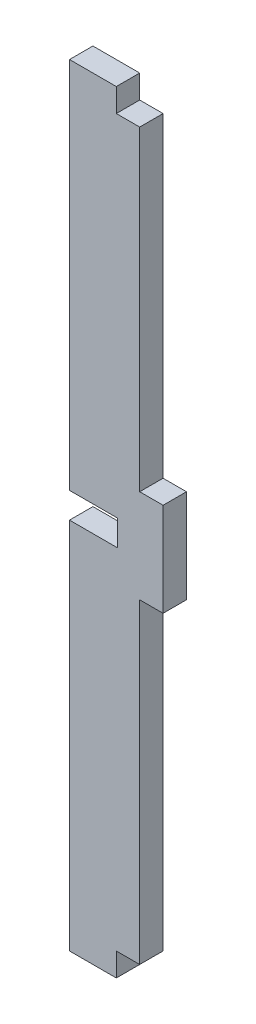
ISO-10303-21;
HEADER;
FILE_DESCRIPTION(('STEP AP214'),'2;1');
FILE_NAME('part.step','',(''),(''),'','','');
FILE_SCHEMA(('AUTOMOTIVE_DESIGN { 1 0 10303 214 1 1 1 1 }'));
ENDSEC;
DATA;
#1=APPLICATION_CONTEXT('core data for automotive mechanical design processes');
#2=APPLICATION_PROTOCOL_DEFINITION('international standard','automotive_design',2000,#1);
#3=PRODUCT_CONTEXT('',#1,'mechanical');
#4=PRODUCT('Part','Part','',(#3));
#5=PRODUCT_RELATED_PRODUCT_CATEGORY('part','',(#4));
#6=PRODUCT_DEFINITION_FORMATION('','',#4);
#7=PRODUCT_DEFINITION_CONTEXT('part definition',#1,'design');
#8=PRODUCT_DEFINITION('design','',#6,#7);
#9=PRODUCT_DEFINITION_SHAPE('','',#8);
#10=(LENGTH_UNIT() NAMED_UNIT(*) SI_UNIT(.MILLI.,.METRE.));
#11=(NAMED_UNIT(*) PLANE_ANGLE_UNIT() SI_UNIT($,.RADIAN.));
#12=(NAMED_UNIT(*) SI_UNIT($,.STERADIAN.) SOLID_ANGLE_UNIT());
#13=UNCERTAINTY_MEASURE_WITH_UNIT(LENGTH_MEASURE(1.E-05),#10,'distance_accuracy_value','');
#14=(GEOMETRIC_REPRESENTATION_CONTEXT(3) GLOBAL_UNCERTAINTY_ASSIGNED_CONTEXT((#13)) GLOBAL_UNIT_ASSIGNED_CONTEXT((#10,
#11,#12)) REPRESENTATION_CONTEXT('',''));
#15=CARTESIAN_POINT('',(0.,0.,0.));
#16=DIRECTION('',(0.,0.,1.));
#17=DIRECTION('',(1.,0.,0.));
#18=AXIS2_PLACEMENT_3D('',#15,#16,#17);
#19=CARTESIAN_POINT('',(-321.454340614118,-53.9411673747447,2.5));
#20=DIRECTION('',(0.,-1.,0.));
#21=DIRECTION('',(0.,0.,-1.));
#22=AXIS2_PLACEMENT_3D('',#19,#20,#21);
#23=PLANE('',#22);
#24=DIRECTION('',(-1.,0.,0.));
#25=VECTOR('',#24,1.);
#26=CARTESIAN_POINT('',(-321.454340614118,-53.9411673747447,-2.5));
#27=LINE('',#26,#25);
#28=CARTESIAN_POINT('',(-321.454340614118,-53.9411673747447,-2.5));
#29=VERTEX_POINT('',#28);
#30=CARTESIAN_POINT('',(-326.454340614118,-53.9411673747447,-2.5));
#31=VERTEX_POINT('',#30);
#32=EDGE_CURVE('E177',#29,#31,#27,.T.);
#33=ORIENTED_EDGE('',*,*,#32,.T.);
#34=DIRECTION('',(0.,0.,-1.));
#35=VECTOR('',#34,1.);
#36=CARTESIAN_POINT('',(-326.454340614118,-53.9411673747447,2.5));
#37=LINE('',#36,#35);
#38=CARTESIAN_POINT('',(-326.454340614118,-53.9411673747447,2.5));
#39=VERTEX_POINT('',#38);
#40=EDGE_CURVE('E11',#39,#31,#37,.T.);
#41=ORIENTED_EDGE('',*,*,#40,.F.);
#42=DIRECTION('',(-1.,0.,0.));
#43=VECTOR('',#42,1.);
#44=CARTESIAN_POINT('',(-321.454340614118,-53.9411673747447,2.5));
#45=LINE('',#44,#43);
#46=CARTESIAN_POINT('',(-321.454340614118,-53.9411673747447,2.5));
#47=VERTEX_POINT('',#46);
#48=EDGE_CURVE('E207',#47,#39,#45,.T.);
#49=ORIENTED_EDGE('',*,*,#48,.F.);
#50=DIRECTION('',(0.,0.,-1.));
#51=VECTOR('',#50,1.);
#52=CARTESIAN_POINT('',(-321.454340614118,-53.9411673747447,2.5));
#53=LINE('',#52,#51);
#54=EDGE_CURVE('E173',#47,#29,#53,.T.);
#55=ORIENTED_EDGE('',*,*,#54,.T.);
#56=EDGE_LOOP('',(#33,#41,#49,#55));
#57=FACE_BOUND('',#56,.T.);
#58=ADVANCED_FACE('F33',(#57),#23,.F.);
#59=CARTESIAN_POINT('',(-326.454340614118,-53.9411673747447,2.5));
#60=DIRECTION('',(-1.,0.,0.));
#61=DIRECTION('',(0.,0.,1.));
#62=AXIS2_PLACEMENT_3D('',#59,#60,#61);
#63=PLANE('',#62);
#64=DIRECTION('',(0.,1.,0.));
#65=VECTOR('',#64,1.);
#66=CARTESIAN_POINT('',(-326.454340614118,-53.9411673747447,-2.5));
#67=LINE('',#66,#65);
#68=CARTESIAN_POINT('',(-326.454340614118,-48.9411673747447,-2.5));
#69=VERTEX_POINT('',#68);
#70=EDGE_CURVE('E180',#31,#69,#67,.T.);
#71=ORIENTED_EDGE('',*,*,#70,.T.);
#72=DIRECTION('',(0.,0.,-1.));
#73=VECTOR('',#72,1.);
#74=CARTESIAN_POINT('',(-326.454340614118,-48.9411673747447,2.5));
#75=LINE('',#74,#73);
#76=CARTESIAN_POINT('',(-326.454340614118,-48.9411673747447,2.5));
#77=VERTEX_POINT('',#76);
#78=EDGE_CURVE('E41',#77,#69,#75,.T.);
#79=ORIENTED_EDGE('',*,*,#78,.F.);
#80=DIRECTION('',(0.,1.,0.));
#81=VECTOR('',#80,1.);
#82=CARTESIAN_POINT('',(-326.454340614118,-53.9411673747447,2.5));
#83=LINE('',#82,#81);
#84=EDGE_CURVE('E116',#39,#77,#83,.T.);
#85=ORIENTED_EDGE('',*,*,#84,.F.);
#86=ORIENTED_EDGE('',*,*,#40,.T.);
#87=EDGE_LOOP('',(#71,#79,#85,#86));
#88=FACE_BOUND('',#87,.T.);
#89=ADVANCED_FACE('F305',(#88),#63,.F.);
#90=CARTESIAN_POINT('',(-326.454340614118,-48.9411673747447,2.5));
#91=DIRECTION('',(0.,-1.,0.));
#92=DIRECTION('',(0.,0.,-1.));
#93=AXIS2_PLACEMENT_3D('',#90,#91,#92);
#94=PLANE('',#93);
#95=DIRECTION('',(-1.,0.,0.));
#96=VECTOR('',#95,1.);
#97=CARTESIAN_POINT('',(-326.454340614118,-48.9411673747447,-2.5));
#98=LINE('',#97,#96);
#99=CARTESIAN_POINT('',(-336.454340614118,-48.9411673747447,-2.5));
#100=VERTEX_POINT('',#99);
#101=EDGE_CURVE('E182',#69,#100,#98,.T.);
#102=ORIENTED_EDGE('',*,*,#101,.T.);
#103=DIRECTION('',(0.,0.,-1.));
#104=VECTOR('',#103,1.);
#105=CARTESIAN_POINT('',(-336.454340614118,-48.9411673747447,2.5));
#106=LINE('',#105,#104);
#107=CARTESIAN_POINT('',(-336.454340614118,-48.9411673747447,2.5));
#108=VERTEX_POINT('',#107);
#109=EDGE_CURVE('E238',#108,#100,#106,.T.);
#110=ORIENTED_EDGE('',*,*,#109,.F.);
#111=DIRECTION('',(-1.,0.,0.));
#112=VECTOR('',#111,1.);
#113=CARTESIAN_POINT('',(-326.454340614118,-48.9411673747447,2.5));
#114=LINE('',#113,#112);
#115=EDGE_CURVE('E246',#77,#108,#114,.T.);
#116=ORIENTED_EDGE('',*,*,#115,.F.);
#117=ORIENTED_EDGE('',*,*,#78,.T.);
#118=EDGE_LOOP('',(#102,#110,#116,#117));
#119=FACE_BOUND('',#118,.T.);
#120=ADVANCED_FACE('F244',(#119),#94,.F.);
#121=CARTESIAN_POINT('',(-336.454340614118,-48.9411673747447,2.5));
#122=DIRECTION('',(1.,0.,0.));
#123=DIRECTION('',(0.,0.,-1.));
#124=AXIS2_PLACEMENT_3D('',#121,#122,#123);
#125=PLANE('',#124);
#126=DIRECTION('',(0.,-1.,0.));
#127=VECTOR('',#126,1.);
#128=CARTESIAN_POINT('',(-336.454340614118,-48.9411673747447,-2.5));
#129=LINE('',#128,#127);
#130=CARTESIAN_POINT('',(-336.454340614118,-128.691167374745,-2.5));
#131=VERTEX_POINT('',#130);
#132=EDGE_CURVE('E184',#100,#131,#129,.T.);
#133=ORIENTED_EDGE('',*,*,#132,.T.);
#134=DIRECTION('',(0.,0.,-1.));
#135=VECTOR('',#134,1.);
#136=CARTESIAN_POINT('',(-336.454340614118,-128.691167374745,2.5));
#137=LINE('',#136,#135);
#138=CARTESIAN_POINT('',(-336.454340614118,-128.691167374745,2.5));
#139=VERTEX_POINT('',#138);
#140=EDGE_CURVE('E235',#139,#131,#137,.T.);
#141=ORIENTED_EDGE('',*,*,#140,.F.);
#142=DIRECTION('',(0.,-1.,0.));
#143=VECTOR('',#142,1.);
#144=CARTESIAN_POINT('',(-336.454340614118,-48.9411673747447,2.5));
#145=LINE('',#144,#143);
#146=EDGE_CURVE('E264',#108,#139,#145,.T.);
#147=ORIENTED_EDGE('',*,*,#146,.F.);
#148=ORIENTED_EDGE('',*,*,#109,.T.);
#149=EDGE_LOOP('',(#133,#141,#147,#148));
#150=FACE_BOUND('',#149,.T.);
#151=ADVANCED_FACE('F255',(#150),#125,.F.);
#152=CARTESIAN_POINT('',(-326.204340614119,-128.691167374744,2.5));
#153=DIRECTION('',(0.,1.,0.));
#154=DIRECTION('',(-1.,0.,0.));
#155=AXIS2_PLACEMENT_3D('',#152,#153,#154);
#156=PLANE('',#155);
#157=DIRECTION('',(1.,0.,0.));
#158=VECTOR('',#157,1.);
#159=CARTESIAN_POINT('',(-326.204340614119,-128.691167374744,-2.5));
#160=LINE('',#159,#158);
#161=CARTESIAN_POINT('',(-326.204340614119,-128.691167374744,-2.5));
#162=VERTEX_POINT('',#161);
#163=EDGE_CURVE('E186',#131,#162,#160,.T.);
#164=ORIENTED_EDGE('',*,*,#163,.T.);
#165=DIRECTION('',(0.,0.,-1.));
#166=VECTOR('',#165,1.);
#167=CARTESIAN_POINT('',(-326.204340614119,-128.691167374744,2.5));
#168=LINE('',#167,#166);
#169=CARTESIAN_POINT('',(-326.204340614119,-128.691167374744,2.5));
#170=VERTEX_POINT('',#169);
#171=EDGE_CURVE('E232',#170,#162,#168,.T.);
#172=ORIENTED_EDGE('',*,*,#171,.F.);
#173=DIRECTION('',(1.,0.,0.));
#174=VECTOR('',#173,1.);
#175=CARTESIAN_POINT('',(-326.204340614119,-128.691167374744,2.5));
#176=LINE('',#175,#174);
#177=EDGE_CURVE('E261',#139,#170,#176,.T.);
#178=ORIENTED_EDGE('',*,*,#177,.F.);
#179=ORIENTED_EDGE('',*,*,#140,.T.);
#180=EDGE_LOOP('',(#164,#172,#178,#179));
#181=FACE_BOUND('',#180,.T.);
#182=ADVANCED_FACE('F259',(#181),#156,.F.);
#183=CARTESIAN_POINT('',(-326.204340614119,-134.191167374745,2.5));
#184=DIRECTION('',(1.,0.,0.));
#185=DIRECTION('',(0.,0.,-1.));
#186=AXIS2_PLACEMENT_3D('',#183,#184,#185);
#187=PLANE('',#186);
#188=DIRECTION('',(0.,-1.,0.));
#189=VECTOR('',#188,1.);
#190=CARTESIAN_POINT('',(-326.204340614119,-134.191167374745,-2.5));
#191=LINE('',#190,#189);
#192=CARTESIAN_POINT('',(-326.204340614119,-134.191167374745,-2.5));
#193=VERTEX_POINT('',#192);
#194=EDGE_CURVE('E188',#162,#193,#191,.T.);
#195=ORIENTED_EDGE('',*,*,#194,.T.);
#196=DIRECTION('',(0.,0.,-1.));
#197=VECTOR('',#196,1.);
#198=CARTESIAN_POINT('',(-326.204340614119,-134.191167374745,2.5));
#199=LINE('',#198,#197);
#200=CARTESIAN_POINT('',(-326.204340614119,-134.191167374745,2.5));
#201=VERTEX_POINT('',#200);
#202=EDGE_CURVE('E229',#201,#193,#199,.T.);
#203=ORIENTED_EDGE('',*,*,#202,.F.);
#204=DIRECTION('',(0.,-1.,0.));
#205=VECTOR('',#204,1.);
#206=CARTESIAN_POINT('',(-326.204340614119,-134.191167374745,2.5));
#207=LINE('',#206,#205);
#208=EDGE_CURVE('E263',#170,#201,#207,.T.);
#209=ORIENTED_EDGE('',*,*,#208,.F.);
#210=ORIENTED_EDGE('',*,*,#171,.T.);
#211=EDGE_LOOP('',(#195,#203,#209,#210));
#212=FACE_BOUND('',#211,.T.);
#213=ADVANCED_FACE('F318',(#212),#187,.F.);
#214=CARTESIAN_POINT('',(-336.454340614118,-134.191167374745,2.5));
#215=DIRECTION('',(0.,-1.,0.));
#216=DIRECTION('',(1.,0.,0.));
#217=AXIS2_PLACEMENT_3D('',#214,#215,#216);
#218=PLANE('',#217);
#219=DIRECTION('',(-1.,0.,0.));
#220=VECTOR('',#219,1.);
#221=CARTESIAN_POINT('',(-336.454340614118,-134.191167374745,-2.5));
#222=LINE('',#221,#220);
#223=CARTESIAN_POINT('',(-336.454340614118,-134.191167374745,-2.5));
#224=VERTEX_POINT('',#223);
#225=EDGE_CURVE('E190',#193,#224,#222,.T.);
#226=ORIENTED_EDGE('',*,*,#225,.T.);
#227=DIRECTION('',(0.,0.,-1.));
#228=VECTOR('',#227,1.);
#229=CARTESIAN_POINT('',(-336.454340614118,-134.191167374745,2.5));
#230=LINE('',#229,#228);
#231=CARTESIAN_POINT('',(-336.454340614118,-134.191167374745,2.5));
#232=VERTEX_POINT('',#231);
#233=EDGE_CURVE('E226',#232,#224,#230,.T.);
#234=ORIENTED_EDGE('',*,*,#233,.F.);
#235=DIRECTION('',(-1.,0.,0.));
#236=VECTOR('',#235,1.);
#237=CARTESIAN_POINT('',(-336.454340614118,-134.191167374745,2.5));
#238=LINE('',#237,#236);
#239=EDGE_CURVE('E266',#201,#232,#238,.T.);
#240=ORIENTED_EDGE('',*,*,#239,.F.);
#241=ORIENTED_EDGE('',*,*,#202,.T.);
#242=EDGE_LOOP('',(#226,#234,#240,#241));
#243=FACE_BOUND('',#242,.T.);
#244=ADVANCED_FACE('F321',(#243),#218,.F.);
#245=CARTESIAN_POINT('',(-336.454340614118,-134.191167374745,2.5));
#246=DIRECTION('',(1.,0.,0.));
#247=DIRECTION('',(0.,0.,-1.));
#248=AXIS2_PLACEMENT_3D('',#245,#246,#247);
#249=PLANE('',#248);
#250=DIRECTION('',(0.,-1.,0.));
#251=VECTOR('',#250,1.);
#252=CARTESIAN_POINT('',(-336.454340614118,-134.191167374745,-2.5));
#253=LINE('',#252,#251);
#254=CARTESIAN_POINT('',(-336.454340614118,-213.941167374745,-2.5));
#255=VERTEX_POINT('',#254);
#256=EDGE_CURVE('E192',#224,#255,#253,.T.);
#257=ORIENTED_EDGE('',*,*,#256,.T.);
#258=DIRECTION('',(0.,0.,-1.));
#259=VECTOR('',#258,1.);
#260=CARTESIAN_POINT('',(-336.454340614118,-213.941167374745,2.5));
#261=LINE('',#260,#259);
#262=CARTESIAN_POINT('',(-336.454340614118,-213.941167374745,2.5));
#263=VERTEX_POINT('',#262);
#264=EDGE_CURVE('E223',#263,#255,#261,.T.);
#265=ORIENTED_EDGE('',*,*,#264,.F.);
#266=DIRECTION('',(0.,-1.,0.));
#267=VECTOR('',#266,1.);
#268=CARTESIAN_POINT('',(-336.454340614118,-134.191167374745,2.5));
#269=LINE('',#268,#267);
#270=EDGE_CURVE('E272',#232,#263,#269,.T.);
#271=ORIENTED_EDGE('',*,*,#270,.F.);
#272=ORIENTED_EDGE('',*,*,#233,.T.);
#273=EDGE_LOOP('',(#257,#265,#271,#272));
#274=FACE_BOUND('',#273,.T.);
#275=ADVANCED_FACE('F325',(#274),#249,.F.);
#276=CARTESIAN_POINT('',(-336.454340614118,-213.941167374745,2.5));
#277=DIRECTION('',(0.,1.,0.));
#278=DIRECTION('',(-1.,0.,0.));
#279=AXIS2_PLACEMENT_3D('',#276,#277,#278);
#280=PLANE('',#279);
#281=DIRECTION('',(1.,0.,0.));
#282=VECTOR('',#281,1.);
#283=CARTESIAN_POINT('',(-336.454340614118,-213.941167374745,-2.5));
#284=LINE('',#283,#282);
#285=CARTESIAN_POINT('',(-326.454340614118,-213.941167374745,-2.5));
#286=VERTEX_POINT('',#285);
#287=EDGE_CURVE('E194',#255,#286,#284,.T.);
#288=ORIENTED_EDGE('',*,*,#287,.T.);
#289=DIRECTION('',(0.,0.,-1.));
#290=VECTOR('',#289,1.);
#291=CARTESIAN_POINT('',(-326.454340614118,-213.941167374745,2.5));
#292=LINE('',#291,#290);
#293=CARTESIAN_POINT('',(-326.454340614118,-213.941167374745,2.5));
#294=VERTEX_POINT('',#293);
#295=EDGE_CURVE('E220',#294,#286,#292,.T.);
#296=ORIENTED_EDGE('',*,*,#295,.F.);
#297=DIRECTION('',(1.,0.,0.));
#298=VECTOR('',#297,1.);
#299=CARTESIAN_POINT('',(-336.454340614118,-213.941167374745,2.5));
#300=LINE('',#299,#298);
#301=EDGE_CURVE('E274',#263,#294,#300,.T.);
#302=ORIENTED_EDGE('',*,*,#301,.F.);
#303=ORIENTED_EDGE('',*,*,#264,.T.);
#304=EDGE_LOOP('',(#288,#296,#302,#303));
#305=FACE_BOUND('',#304,.T.);
#306=ADVANCED_FACE('F329',(#305),#280,.F.);
#307=CARTESIAN_POINT('',(-326.454340614118,-213.941167374745,2.5));
#308=DIRECTION('',(-1.,0.,0.));
#309=DIRECTION('',(0.,0.,1.));
#310=AXIS2_PLACEMENT_3D('',#307,#308,#309);
#311=PLANE('',#310);
#312=DIRECTION('',(0.,1.,0.));
#313=VECTOR('',#312,1.);
#314=CARTESIAN_POINT('',(-326.454340614118,-213.941167374745,-2.5));
#315=LINE('',#314,#313);
#316=CARTESIAN_POINT('',(-326.454340614118,-208.941167374745,-2.5));
#317=VERTEX_POINT('',#316);
#318=EDGE_CURVE('E196',#286,#317,#315,.T.);
#319=ORIENTED_EDGE('',*,*,#318,.T.);
#320=DIRECTION('',(0.,0.,-1.));
#321=VECTOR('',#320,1.);
#322=CARTESIAN_POINT('',(-326.454340614118,-208.941167374745,2.5));
#323=LINE('',#322,#321);
#324=CARTESIAN_POINT('',(-326.454340614118,-208.941167374745,2.5));
#325=VERTEX_POINT('',#324);
#326=EDGE_CURVE('E217',#325,#317,#323,.T.);
#327=ORIENTED_EDGE('',*,*,#326,.F.);
#328=DIRECTION('',(0.,1.,0.));
#329=VECTOR('',#328,1.);
#330=CARTESIAN_POINT('',(-326.454340614118,-213.941167374745,2.5));
#331=LINE('',#330,#329);
#332=EDGE_CURVE('E276',#294,#325,#331,.T.);
#333=ORIENTED_EDGE('',*,*,#332,.F.);
#334=ORIENTED_EDGE('',*,*,#295,.T.);
#335=EDGE_LOOP('',(#319,#327,#333,#334));
#336=FACE_BOUND('',#335,.T.);
#337=ADVANCED_FACE('F333',(#336),#311,.F.);
#338=CARTESIAN_POINT('',(-326.454340614118,-208.941167374745,2.5));
#339=DIRECTION('',(0.,1.,0.));
#340=DIRECTION('',(-1.,0.,0.));
#341=AXIS2_PLACEMENT_3D('',#338,#339,#340);
#342=PLANE('',#341);
#343=DIRECTION('',(1.,0.,0.));
#344=VECTOR('',#343,1.);
#345=CARTESIAN_POINT('',(-326.454340614118,-208.941167374745,-2.5));
#346=LINE('',#345,#344);
#347=CARTESIAN_POINT('',(-321.454340614117,-208.941167374744,-2.5));
#348=VERTEX_POINT('',#347);
#349=EDGE_CURVE('E198',#317,#348,#346,.T.);
#350=ORIENTED_EDGE('',*,*,#349,.T.);
#351=DIRECTION('',(0.,0.,-1.));
#352=VECTOR('',#351,1.);
#353=CARTESIAN_POINT('',(-321.454340614117,-208.941167374744,2.5));
#354=LINE('',#353,#352);
#355=CARTESIAN_POINT('',(-321.454340614117,-208.941167374744,2.5));
#356=VERTEX_POINT('',#355);
#357=EDGE_CURVE('E214',#356,#348,#354,.T.);
#358=ORIENTED_EDGE('',*,*,#357,.F.);
#359=DIRECTION('',(1.,0.,0.));
#360=VECTOR('',#359,1.);
#361=CARTESIAN_POINT('',(-326.454340614118,-208.941167374745,2.5));
#362=LINE('',#361,#360);
#363=EDGE_CURVE('E278',#325,#356,#362,.T.);
#364=ORIENTED_EDGE('',*,*,#363,.F.);
#365=ORIENTED_EDGE('',*,*,#326,.T.);
#366=EDGE_LOOP('',(#350,#358,#364,#365));
#367=FACE_BOUND('',#366,.T.);
#368=ADVANCED_FACE('F337',(#367),#342,.F.);
#369=CARTESIAN_POINT('',(-321.454340614117,-208.941167374744,2.5));
#370=DIRECTION('',(-1.,0.,0.));
#371=DIRECTION('',(0.,-1.,0.));
#372=AXIS2_PLACEMENT_3D('',#369,#370,#371);
#373=PLANE('',#372);
#374=DIRECTION('',(0.,1.,0.));
#375=VECTOR('',#374,1.);
#376=CARTESIAN_POINT('',(-321.454340614117,-208.941167374744,-2.5));
#377=LINE('',#376,#375);
#378=CARTESIAN_POINT('',(-321.454340614119,-141.441167374744,-2.5));
#379=VERTEX_POINT('',#378);
#380=EDGE_CURVE('E200',#348,#379,#377,.T.);
#381=ORIENTED_EDGE('',*,*,#380,.T.);
#382=DIRECTION('',(0.,0.,-1.));
#383=VECTOR('',#382,1.);
#384=CARTESIAN_POINT('',(-321.454340614119,-141.441167374744,2.5));
#385=LINE('',#384,#383);
#386=CARTESIAN_POINT('',(-321.454340614119,-141.441167374744,2.5));
#387=VERTEX_POINT('',#386);
#388=EDGE_CURVE('E211',#387,#379,#385,.T.);
#389=ORIENTED_EDGE('',*,*,#388,.F.);
#390=DIRECTION('',(0.,1.,0.));
#391=VECTOR('',#390,1.);
#392=CARTESIAN_POINT('',(-321.454340614117,-208.941167374744,2.5));
#393=LINE('',#392,#391);
#394=EDGE_CURVE('E280',#356,#387,#393,.T.);
#395=ORIENTED_EDGE('',*,*,#394,.F.);
#396=ORIENTED_EDGE('',*,*,#357,.T.);
#397=EDGE_LOOP('',(#381,#389,#395,#396));
#398=FACE_BOUND('',#397,.T.);
#399=ADVANCED_FACE('F286',(#398),#373,.F.);
#400=CARTESIAN_POINT('',(-321.454340614119,-141.441167374744,2.5));
#401=DIRECTION('',(0.,1.,0.));
#402=DIRECTION('',(0.,0.,1.));
#403=AXIS2_PLACEMENT_3D('',#400,#401,#402);
#404=PLANE('',#403);
#405=DIRECTION('',(1.,0.,0.));
#406=VECTOR('',#405,1.);
#407=CARTESIAN_POINT('',(-321.454340614119,-141.441167374744,-2.5));
#408=LINE('',#407,#406);
#409=CARTESIAN_POINT('',(-316.45434061412,-141.441167374744,-2.5));
#410=VERTEX_POINT('',#409);
#411=EDGE_CURVE('E202',#379,#410,#408,.T.);
#412=ORIENTED_EDGE('',*,*,#411,.T.);
#413=DIRECTION('',(0.,0.,-1.));
#414=VECTOR('',#413,1.);
#415=CARTESIAN_POINT('',(-316.45434061412,-141.441167374744,2.5));
#416=LINE('',#415,#414);
#417=CARTESIAN_POINT('',(-316.45434061412,-141.441167374744,2.5));
#418=VERTEX_POINT('',#417);
#419=EDGE_CURVE('E168',#418,#410,#416,.T.);
#420=ORIENTED_EDGE('',*,*,#419,.F.);
#421=DIRECTION('',(1.,0.,0.));
#422=VECTOR('',#421,1.);
#423=CARTESIAN_POINT('',(-321.454340614119,-141.441167374744,2.5));
#424=LINE('',#423,#422);
#425=EDGE_CURVE('E159',#387,#418,#424,.T.);
#426=ORIENTED_EDGE('',*,*,#425,.F.);
#427=ORIENTED_EDGE('',*,*,#388,.T.);
#428=EDGE_LOOP('',(#412,#420,#426,#427));
#429=FACE_BOUND('',#428,.T.);
#430=ADVANCED_FACE('F290',(#429),#404,.F.);
#431=CARTESIAN_POINT('',(-316.45434061412,-141.441167374744,2.5));
#432=DIRECTION('',(-1.,0.,0.));
#433=DIRECTION('',(0.,-1.,0.));
#434=AXIS2_PLACEMENT_3D('',#431,#432,#433);
#435=PLANE('',#434);
#436=DIRECTION('',(0.,1.,0.));
#437=VECTOR('',#436,1.);
#438=CARTESIAN_POINT('',(-316.45434061412,-141.441167374744,-2.5));
#439=LINE('',#438,#437);
#440=CARTESIAN_POINT('',(-316.454340614122,-121.441167374744,-2.5));
#441=VERTEX_POINT('',#440);
#442=EDGE_CURVE('E167',#410,#441,#439,.T.);
#443=ORIENTED_EDGE('',*,*,#442,.T.);
#444=DIRECTION('',(0.,0.,-1.));
#445=VECTOR('',#444,1.);
#446=CARTESIAN_POINT('',(-316.454340614122,-121.441167374744,2.5));
#447=LINE('',#446,#445);
#448=CARTESIAN_POINT('',(-316.454340614122,-121.441167374744,2.5));
#449=VERTEX_POINT('',#448);
#450=EDGE_CURVE('E164',#449,#441,#447,.T.);
#451=ORIENTED_EDGE('',*,*,#450,.F.);
#452=DIRECTION('',(0.,1.,0.));
#453=VECTOR('',#452,1.);
#454=CARTESIAN_POINT('',(-316.45434061412,-141.441167374744,2.5));
#455=LINE('',#454,#453);
#456=EDGE_CURVE('E153',#418,#449,#455,.T.);
#457=ORIENTED_EDGE('',*,*,#456,.F.);
#458=ORIENTED_EDGE('',*,*,#419,.T.);
#459=EDGE_LOOP('',(#443,#451,#457,#458));
#460=FACE_BOUND('',#459,.T.);
#461=ADVANCED_FACE('F165',(#460),#435,.F.);
#462=CARTESIAN_POINT('',(-316.454340614122,-121.441167374744,2.5));
#463=DIRECTION('',(0.,-1.,0.));
#464=DIRECTION('',(1.,0.,0.));
#465=AXIS2_PLACEMENT_3D('',#462,#463,#464);
#466=PLANE('',#465);
#467=DIRECTION('',(-1.,0.,0.));
#468=VECTOR('',#467,1.);
#469=CARTESIAN_POINT('',(-316.454340614122,-121.441167374744,-2.5));
#470=LINE('',#469,#468);
#471=CARTESIAN_POINT('',(-321.454340614118,-121.441167374745,-2.5));
#472=VERTEX_POINT('',#471);
#473=EDGE_CURVE('E102',#441,#472,#470,.T.);
#474=ORIENTED_EDGE('',*,*,#473,.T.);
#475=DIRECTION('',(0.,0.,-1.));
#476=VECTOR('',#475,1.);
#477=CARTESIAN_POINT('',(-321.454340614118,-121.441167374745,2.5));
#478=LINE('',#477,#476);
#479=CARTESIAN_POINT('',(-321.454340614118,-121.441167374745,2.5));
#480=VERTEX_POINT('',#479);
#481=EDGE_CURVE('E169',#480,#472,#478,.T.);
#482=ORIENTED_EDGE('',*,*,#481,.F.);
#483=DIRECTION('',(-1.,0.,0.));
#484=VECTOR('',#483,1.);
#485=CARTESIAN_POINT('',(-316.454340614122,-121.441167374744,2.5));
#486=LINE('',#485,#484);
#487=EDGE_CURVE('E157',#449,#480,#486,.T.);
#488=ORIENTED_EDGE('',*,*,#487,.F.);
#489=ORIENTED_EDGE('',*,*,#450,.T.);
#490=EDGE_LOOP('',(#474,#482,#488,#489));
#491=FACE_BOUND('',#490,.T.);
#492=ADVANCED_FACE('F171',(#491),#466,.F.);
#493=CARTESIAN_POINT('',(-321.454340614118,-121.441167374745,2.5));
#494=DIRECTION('',(-1.,0.,0.));
#495=DIRECTION('',(0.,0.,1.));
#496=AXIS2_PLACEMENT_3D('',#493,#494,#495);
#497=PLANE('',#496);
#498=DIRECTION('',(0.,1.,0.));
#499=VECTOR('',#498,1.);
#500=CARTESIAN_POINT('',(-321.454340614118,-121.441167374745,-2.5));
#501=LINE('',#500,#499);
#502=EDGE_CURVE('E108',#472,#29,#501,.T.);
#503=ORIENTED_EDGE('',*,*,#502,.T.);
#504=ORIENTED_EDGE('',*,*,#54,.F.);
#505=DIRECTION('',(0.,1.,0.));
#506=VECTOR('',#505,1.);
#507=CARTESIAN_POINT('',(-321.454340614118,-121.441167374745,2.5));
#508=LINE('',#507,#506);
#509=EDGE_CURVE('E49',#480,#47,#508,.T.);
#510=ORIENTED_EDGE('',*,*,#509,.F.);
#511=ORIENTED_EDGE('',*,*,#481,.T.);
#512=EDGE_LOOP('',(#503,#504,#510,#511));
#513=FACE_BOUND('',#512,.T.);
#514=ADVANCED_FACE('F294',(#513),#497,.F.);
#515=CARTESIAN_POINT('',(0.,0.,2.5));
#516=DIRECTION('',(0.,0.,-1.));
#517=DIRECTION('',(-1.,0.,0.));
#518=AXIS2_PLACEMENT_3D('',#515,#516,#517);
#519=PLANE('',#518);
#520=ORIENTED_EDGE('',*,*,#48,.T.);
#521=ORIENTED_EDGE('',*,*,#84,.T.);
#522=ORIENTED_EDGE('',*,*,#115,.T.);
#523=ORIENTED_EDGE('',*,*,#146,.T.);
#524=ORIENTED_EDGE('',*,*,#177,.T.);
#525=ORIENTED_EDGE('',*,*,#208,.T.);
#526=ORIENTED_EDGE('',*,*,#239,.T.);
#527=ORIENTED_EDGE('',*,*,#270,.T.);
#528=ORIENTED_EDGE('',*,*,#301,.T.);
#529=ORIENTED_EDGE('',*,*,#332,.T.);
#530=ORIENTED_EDGE('',*,*,#363,.T.);
#531=ORIENTED_EDGE('',*,*,#394,.T.);
#532=ORIENTED_EDGE('',*,*,#425,.T.);
#533=ORIENTED_EDGE('',*,*,#456,.T.);
#534=ORIENTED_EDGE('',*,*,#487,.T.);
#535=ORIENTED_EDGE('',*,*,#509,.T.);
#536=EDGE_LOOP('',(#520,#521,#522,#523,#524,#525,#526,#527,#528,#529,#530,#531,#532,#533,#534,#535));
#537=FACE_BOUND('',#536,.T.);
#538=ADVANCED_FACE('F155',(#537),#519,.F.);
#539=CARTESIAN_POINT('',(0.,0.,-2.5));
#540=DIRECTION('',(0.,0.,-1.));
#541=DIRECTION('',(-1.,0.,0.));
#542=AXIS2_PLACEMENT_3D('',#539,#540,#541);
#543=PLANE('',#542);
#544=ORIENTED_EDGE('',*,*,#32,.F.);
#545=ORIENTED_EDGE('',*,*,#502,.F.);
#546=ORIENTED_EDGE('',*,*,#473,.F.);
#547=ORIENTED_EDGE('',*,*,#442,.F.);
#548=ORIENTED_EDGE('',*,*,#411,.F.);
#549=ORIENTED_EDGE('',*,*,#380,.F.);
#550=ORIENTED_EDGE('',*,*,#349,.F.);
#551=ORIENTED_EDGE('',*,*,#318,.F.);
#552=ORIENTED_EDGE('',*,*,#287,.F.);
#553=ORIENTED_EDGE('',*,*,#256,.F.);
#554=ORIENTED_EDGE('',*,*,#225,.F.);
#555=ORIENTED_EDGE('',*,*,#194,.F.);
#556=ORIENTED_EDGE('',*,*,#163,.F.);
#557=ORIENTED_EDGE('',*,*,#132,.F.);
#558=ORIENTED_EDGE('',*,*,#101,.F.);
#559=ORIENTED_EDGE('',*,*,#70,.F.);
#560=EDGE_LOOP('',(#544,#545,#546,#547,#548,#549,#550,#551,#552,#553,#554,#555,#556,#557,#558,#559));
#561=FACE_BOUND('',#560,.T.);
#562=ADVANCED_FACE('F250',(#561),#543,.T.);
#563=CLOSED_SHELL('',(#58,#89,#120,#151,#182,#213,#244,#275,#306,#337,#368,#399,#430,#461,#492,
#514,#538,#562));
#564=MANIFOLD_SOLID_BREP('B2',#563);
#565=ADVANCED_BREP_SHAPE_REPRESENTATION('',(#18,#564),#14);
#566=SHAPE_DEFINITION_REPRESENTATION(#9,#565);
ENDSEC;
END-ISO-10303-21;
